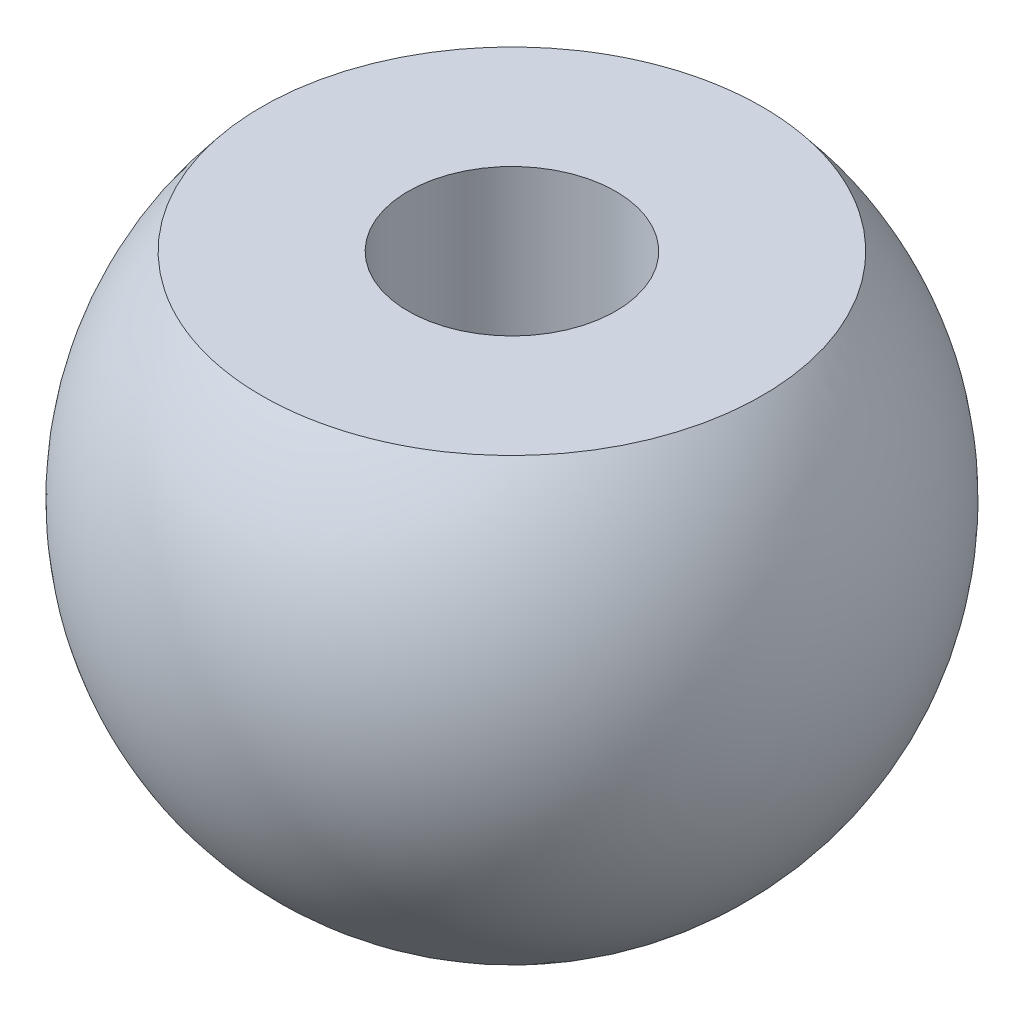
ISO-10303-21;
HEADER;
FILE_DESCRIPTION(('STEP AP214'),'2;1');
FILE_NAME('part.step','',(''),(''),'','','');
FILE_SCHEMA(('AUTOMOTIVE_DESIGN { 1 0 10303 214 1 1 1 1 }'));
ENDSEC;
DATA;
#1=APPLICATION_CONTEXT('core data for automotive mechanical design processes');
#2=APPLICATION_PROTOCOL_DEFINITION('international standard','automotive_design',2000,#1);
#3=PRODUCT_CONTEXT('',#1,'mechanical');
#4=PRODUCT('Part','Part','',(#3));
#5=PRODUCT_RELATED_PRODUCT_CATEGORY('part','',(#4));
#6=PRODUCT_DEFINITION_FORMATION('','',#4);
#7=PRODUCT_DEFINITION_CONTEXT('part definition',#1,'design');
#8=PRODUCT_DEFINITION('design','',#6,#7);
#9=PRODUCT_DEFINITION_SHAPE('','',#8);
#10=(LENGTH_UNIT() NAMED_UNIT(*) SI_UNIT(.MILLI.,.METRE.));
#11=(NAMED_UNIT(*) PLANE_ANGLE_UNIT() SI_UNIT($,.RADIAN.));
#12=(NAMED_UNIT(*) SI_UNIT($,.STERADIAN.) SOLID_ANGLE_UNIT());
#13=UNCERTAINTY_MEASURE_WITH_UNIT(LENGTH_MEASURE(1.E-05),#10,'distance_accuracy_value','');
#14=(GEOMETRIC_REPRESENTATION_CONTEXT(3) GLOBAL_UNCERTAINTY_ASSIGNED_CONTEXT((#13)) GLOBAL_UNIT_ASSIGNED_CONTEXT((#10,
#11,#12)) REPRESENTATION_CONTEXT('',''));
#15=CARTESIAN_POINT('',(0.,0.,0.));
#16=DIRECTION('',(0.,0.,1.));
#17=DIRECTION('',(1.,0.,0.));
#18=AXIS2_PLACEMENT_3D('',#15,#16,#17);
#19=CARTESIAN_POINT('',(0.,-10.,0.));
#20=DIRECTION('',(0.,1.,0.));
#21=DIRECTION('',(0.,0.,1.));
#22=AXIS2_PLACEMENT_3D('',#19,#20,#21);
#23=CYLINDRICAL_SURFACE('',#22,3.15);
#24=CARTESIAN_POINT('',(0.,6.50908328979756,0.));
#25=DIRECTION('',(0.,-1.,0.));
#26=DIRECTION('',(0.,0.,-1.));
#27=AXIS2_PLACEMENT_3D('',#24,#25,#26);
#28=CIRCLE('',#27,3.15);
#29=CARTESIAN_POINT('',(0.,6.50908328979756,-3.15));
#30=VERTEX_POINT('',#29);
#31=EDGE_CURVE('E124',#30,#30,#28,.T.);
#32=ORIENTED_EDGE('',*,*,#31,.F.);
#33=EDGE_LOOP('',(#32));
#34=FACE_BOUND('',#33,.T.);
#35=CARTESIAN_POINT('',(0.,-4.49091671020244,0.));
#36=DIRECTION('',(0.,-1.,0.));
#37=DIRECTION('',(0.,0.,-1.));
#38=AXIS2_PLACEMENT_3D('',#35,#36,#37);
#39=CIRCLE('',#38,3.15);
#40=CARTESIAN_POINT('',(0.,-4.49091671020244,-3.15));
#41=VERTEX_POINT('',#40);
#42=EDGE_CURVE('E141',#41,#41,#39,.F.);
#43=ORIENTED_EDGE('',*,*,#42,.F.);
#44=EDGE_LOOP('',(#43));
#45=FACE_BOUND('',#44,.T.);
#46=ADVANCED_FACE('F43',(#34,#45),#23,.F.);
#47=CARTESIAN_POINT('',(0.,0.,0.));
#48=DIRECTION('',(0.,0.,-1.));
#49=DIRECTION('',(1.,0.,0.));
#50=AXIS2_PLACEMENT_3D('',#47,#48,#49);
#51=SPHERICAL_SURFACE('',#50,10.);
#52=CARTESIAN_POINT('',(0.,6.50908328979756,0.));
#53=DIRECTION('',(0.,-1.,0.));
#54=DIRECTION('',(0.,0.,-1.));
#55=AXIS2_PLACEMENT_3D('',#52,#53,#54);
#56=CIRCLE('',#55,7.5915633914549);
#57=CARTESIAN_POINT('',(0.,6.50908328979756,-7.5915633914549));
#58=VERTEX_POINT('',#57);
#59=EDGE_CURVE('E47',#58,#58,#56,.T.);
#60=ORIENTED_EDGE('',*,*,#59,.T.);
#61=EDGE_LOOP('',(#60));
#62=FACE_BOUND('',#61,.T.);
#63=CARTESIAN_POINT('',(-2.77497783543476,0.,4.30872637943578));
#64=DIRECTION('',(-0.541459089840929,0.,0.840727098426494));
#65=DIRECTION('',(0.840727098426494,0.,0.541459089840929));
#66=AXIS2_PLACEMENT_3D('',#63,#64,#65);
#67=CIRCLE('',#66,8.58687224779779);
#68=CARTESIAN_POINT('',(-5.26262217046646,-8.06096561626872,2.70659217915228));
#69=VERTEX_POINT('',#68);
#70=CARTESIAN_POINT('',(-0.287333500403072,-8.06096561626872,5.91086057971929));
#71=VERTEX_POINT('',#70);
#72=EDGE_CURVE('E158',#69,#71,#67,.T.);
#73=ORIENTED_EDGE('',*,*,#72,.T.);
#74=CARTESIAN_POINT('',(2.34397758483015,0.,4.55756449014315));
#75=DIRECTION('',(0.457361479966859,0.,0.889280876125493));
#76=DIRECTION('',(0.889280876125493,0.,-0.457361479966859));
#77=AXIS2_PLACEMENT_3D('',#74,#75,#76);
#78=CIRCLE('',#77,8.58687224779779);
#79=CARTESIAN_POINT('',(4.97528867006338,-8.06096561626872,3.20426840056701));
#80=VERTEX_POINT('',#79);
#81=EDGE_CURVE('E11',#71,#80,#78,.T.);
#82=ORIENTED_EDGE('',*,*,#81,.T.);
#83=CARTESIAN_POINT('',(5.11895542026492,0.,0.248838110707367));
#84=DIRECTION('',(0.998820569807789,0.,0.0485537776989985));
#85=DIRECTION('',(0.0485537776989985,0.,-0.998820569807789));
#86=AXIS2_PLACEMENT_3D('',#83,#84,#85);
#87=CIRCLE('',#86,8.58687224779779);
#88=CARTESIAN_POINT('',(5.26262217046645,-8.06096561626872,-2.70659217915228));
#89=VERTEX_POINT('',#88);
#90=EDGE_CURVE('E53',#80,#89,#87,.T.);
#91=ORIENTED_EDGE('',*,*,#90,.T.);
#92=CARTESIAN_POINT('',(2.77497783543476,0.,-4.30872637943578));
#93=DIRECTION('',(0.54145908984093,0.,-0.840727098426494));
#94=DIRECTION('',(-0.840727098426494,0.,-0.54145908984093));
#95=AXIS2_PLACEMENT_3D('',#92,#93,#94);
#96=CIRCLE('',#95,8.58687224779779);
#97=CARTESIAN_POINT('',(0.287333500403075,-8.06096561626873,-5.91086057971929));
#98=VERTEX_POINT('',#97);
#99=EDGE_CURVE('E169',#89,#98,#96,.T.);
#100=ORIENTED_EDGE('',*,*,#99,.T.);
#101=CARTESIAN_POINT('',(-2.34397758483015,0.,-4.55756449014315));
#102=DIRECTION('',(-0.457361479966859,0.,-0.889280876125493));
#103=DIRECTION('',(-0.889280876125493,0.,0.457361479966859));
#104=AXIS2_PLACEMENT_3D('',#101,#102,#103);
#105=CIRCLE('',#104,8.5868722477978);
#106=CARTESIAN_POINT('',(-4.97528867006338,-8.06096561626873,-3.20426840056701));
#107=VERTEX_POINT('',#106);
#108=EDGE_CURVE('E165',#98,#107,#105,.T.);
#109=ORIENTED_EDGE('',*,*,#108,.T.);
#110=CARTESIAN_POINT('',(-5.11895542026492,0.,-0.248838110707369));
#111=DIRECTION('',(-0.998820569807789,0.,-0.0485537776989988));
#112=DIRECTION('',(-0.0485537776989988,0.,0.998820569807789));
#113=AXIS2_PLACEMENT_3D('',#110,#111,#112);
#114=CIRCLE('',#113,8.5868722477978);
#115=EDGE_CURVE('E161',#107,#69,#114,.T.);
#116=ORIENTED_EDGE('',*,*,#115,.T.);
#117=EDGE_LOOP('',(#73,#82,#91,#100,#109,#116));
#118=FACE_BOUND('',#117,.T.);
#119=ADVANCED_FACE('F45',(#62,#118),#51,.T.);
#120=CARTESIAN_POINT('',(4.97528867006338,-4.49091671020244,3.20426840056701));
#121=DIRECTION('',(0.457361479966859,0.,0.889280876125493));
#122=DIRECTION('',(0.889280876125493,0.,-0.457361479966859));
#123=AXIS2_PLACEMENT_3D('',#120,#121,#122);
#124=PLANE('',#123);
#125=DIRECTION('',(0.,-1.,0.));
#126=VECTOR('',#125,1.);
#127=CARTESIAN_POINT('',(-0.287333500403072,-4.49091671020244,5.91086057971929));
#128=LINE('',#127,#126);
#129=CARTESIAN_POINT('',(-0.287333500403072,-4.49091671020244,5.91086057971929));
#130=VERTEX_POINT('',#129);
#131=EDGE_CURVE('E60',#130,#71,#128,.T.);
#132=ORIENTED_EDGE('',*,*,#131,.F.);
#133=DIRECTION('',(-0.889280876125493,0.,0.457361479966859));
#134=VECTOR('',#133,1.);
#135=CARTESIAN_POINT('',(4.97528867006338,-4.49091671020244,3.20426840056701));
#136=LINE('',#135,#134);
#137=CARTESIAN_POINT('',(4.97528867006338,-4.49091671020244,3.20426840056701));
#138=VERTEX_POINT('',#137);
#139=EDGE_CURVE('E99',#138,#130,#136,.T.);
#140=ORIENTED_EDGE('',*,*,#139,.F.);
#141=DIRECTION('',(0.,-1.,0.));
#142=VECTOR('',#141,1.);
#143=CARTESIAN_POINT('',(4.97528867006338,-4.49091671020244,3.20426840056701));
#144=LINE('',#143,#142);
#145=EDGE_CURVE('E138',#138,#80,#144,.T.);
#146=ORIENTED_EDGE('',*,*,#145,.T.);
#147=ORIENTED_EDGE('',*,*,#81,.F.);
#148=EDGE_LOOP('',(#132,#140,#146,#147));
#149=FACE_BOUND('',#148,.T.);
#150=ADVANCED_FACE('F97',(#149),#124,.F.);
#151=CARTESIAN_POINT('',(5.26262217046645,-4.49091671020244,-2.70659217915228));
#152=DIRECTION('',(0.998820569807789,0.,0.0485537776989985));
#153=DIRECTION('',(0.0485537776989985,0.,-0.998820569807789));
#154=AXIS2_PLACEMENT_3D('',#151,#152,#153);
#155=PLANE('',#154);
#156=ORIENTED_EDGE('',*,*,#145,.F.);
#157=DIRECTION('',(-0.0485537776989985,0.,0.998820569807789));
#158=VECTOR('',#157,1.);
#159=CARTESIAN_POINT('',(5.26262217046645,-4.49091671020244,-2.70659217915228));
#160=LINE('',#159,#158);
#161=CARTESIAN_POINT('',(5.26262217046645,-4.49091671020244,-2.70659217915228));
#162=VERTEX_POINT('',#161);
#163=EDGE_CURVE('E104',#162,#138,#160,.T.);
#164=ORIENTED_EDGE('',*,*,#163,.F.);
#165=DIRECTION('',(0.,-1.,0.));
#166=VECTOR('',#165,1.);
#167=CARTESIAN_POINT('',(5.26262217046645,-4.49091671020244,-2.70659217915228));
#168=LINE('',#167,#166);
#169=EDGE_CURVE('E142',#162,#89,#168,.T.);
#170=ORIENTED_EDGE('',*,*,#169,.T.);
#171=ORIENTED_EDGE('',*,*,#90,.F.);
#172=EDGE_LOOP('',(#156,#164,#170,#171));
#173=FACE_BOUND('',#172,.T.);
#174=ADVANCED_FACE('F183',(#173),#155,.F.);
#175=CARTESIAN_POINT('',(0.287333500403075,-4.49091671020244,-5.91086057971929));
#176=DIRECTION('',(0.54145908984093,0.,-0.840727098426494));
#177=DIRECTION('',(-0.840727098426494,0.,-0.54145908984093));
#178=AXIS2_PLACEMENT_3D('',#175,#176,#177);
#179=PLANE('',#178);
#180=ORIENTED_EDGE('',*,*,#169,.F.);
#181=DIRECTION('',(0.840727098426494,0.,0.54145908984093));
#182=VECTOR('',#181,1.);
#183=CARTESIAN_POINT('',(0.287333500403075,-4.49091671020244,-5.91086057971929));
#184=LINE('',#183,#182);
#185=CARTESIAN_POINT('',(0.287333500403075,-4.49091671020244,-5.91086057971929));
#186=VERTEX_POINT('',#185);
#187=EDGE_CURVE('E133',#186,#162,#184,.T.);
#188=ORIENTED_EDGE('',*,*,#187,.F.);
#189=DIRECTION('',(0.,-1.,0.));
#190=VECTOR('',#189,1.);
#191=CARTESIAN_POINT('',(0.287333500403075,-4.49091671020244,-5.91086057971929));
#192=LINE('',#191,#190);
#193=EDGE_CURVE('E145',#186,#98,#192,.T.);
#194=ORIENTED_EDGE('',*,*,#193,.T.);
#195=ORIENTED_EDGE('',*,*,#99,.F.);
#196=EDGE_LOOP('',(#180,#188,#194,#195));
#197=FACE_BOUND('',#196,.T.);
#198=ADVANCED_FACE('F182',(#197),#179,.F.);
#199=CARTESIAN_POINT('',(-4.97528867006338,-4.49091671020244,-3.20426840056701));
#200=DIRECTION('',(-0.457361479966859,0.,-0.889280876125493));
#201=DIRECTION('',(-0.889280876125493,0.,0.457361479966859));
#202=AXIS2_PLACEMENT_3D('',#199,#200,#201);
#203=PLANE('',#202);
#204=ORIENTED_EDGE('',*,*,#193,.F.);
#205=DIRECTION('',(0.889280876125493,0.,-0.457361479966859));
#206=VECTOR('',#205,1.);
#207=CARTESIAN_POINT('',(-4.97528867006338,-4.49091671020244,-3.20426840056701));
#208=LINE('',#207,#206);
#209=CARTESIAN_POINT('',(-4.97528867006338,-4.49091671020244,-3.20426840056701));
#210=VERTEX_POINT('',#209);
#211=EDGE_CURVE('E129',#210,#186,#208,.T.);
#212=ORIENTED_EDGE('',*,*,#211,.F.);
#213=DIRECTION('',(0.,-1.,0.));
#214=VECTOR('',#213,1.);
#215=CARTESIAN_POINT('',(-4.97528867006338,-4.49091671020244,-3.20426840056701));
#216=LINE('',#215,#214);
#217=EDGE_CURVE('E149',#210,#107,#216,.T.);
#218=ORIENTED_EDGE('',*,*,#217,.T.);
#219=ORIENTED_EDGE('',*,*,#108,.F.);
#220=EDGE_LOOP('',(#204,#212,#218,#219));
#221=FACE_BOUND('',#220,.T.);
#222=ADVANCED_FACE('F180',(#221),#203,.F.);
#223=CARTESIAN_POINT('',(-5.26262217046645,-4.49091671020244,2.70659217915228));
#224=DIRECTION('',(-0.998820569807789,0.,-0.0485537776989988));
#225=DIRECTION('',(-0.0485537776989988,0.,0.998820569807789));
#226=AXIS2_PLACEMENT_3D('',#223,#224,#225);
#227=PLANE('',#226);
#228=ORIENTED_EDGE('',*,*,#217,.F.);
#229=DIRECTION('',(0.0485537776989988,0.,-0.998820569807789));
#230=VECTOR('',#229,1.);
#231=CARTESIAN_POINT('',(-5.26262217046645,-4.49091671020244,2.70659217915228));
#232=LINE('',#231,#230);
#233=CARTESIAN_POINT('',(-5.26262217046645,-4.49091671020244,2.70659217915228));
#234=VERTEX_POINT('',#233);
#235=EDGE_CURVE('E114',#234,#210,#232,.T.);
#236=ORIENTED_EDGE('',*,*,#235,.F.);
#237=DIRECTION('',(0.,-1.,0.));
#238=VECTOR('',#237,1.);
#239=CARTESIAN_POINT('',(-5.26262217046645,-4.49091671020244,2.70659217915228));
#240=LINE('',#239,#238);
#241=EDGE_CURVE('E103',#234,#69,#240,.T.);
#242=ORIENTED_EDGE('',*,*,#241,.T.);
#243=ORIENTED_EDGE('',*,*,#115,.F.);
#244=EDGE_LOOP('',(#228,#236,#242,#243));
#245=FACE_BOUND('',#244,.T.);
#246=ADVANCED_FACE('F176',(#245),#227,.F.);
#247=CARTESIAN_POINT('',(-0.287333500403072,-4.49091671020244,5.91086057971929));
#248=DIRECTION('',(-0.541459089840929,0.,0.840727098426494));
#249=DIRECTION('',(0.840727098426494,0.,0.541459089840929));
#250=AXIS2_PLACEMENT_3D('',#247,#248,#249);
#251=PLANE('',#250);
#252=ORIENTED_EDGE('',*,*,#241,.F.);
#253=DIRECTION('',(-0.840727098426494,0.,-0.541459089840929));
#254=VECTOR('',#253,1.);
#255=CARTESIAN_POINT('',(-0.287333500403072,-4.49091671020244,5.91086057971929));
#256=LINE('',#255,#254);
#257=EDGE_CURVE('E107',#130,#234,#256,.T.);
#258=ORIENTED_EDGE('',*,*,#257,.F.);
#259=ORIENTED_EDGE('',*,*,#131,.T.);
#260=ORIENTED_EDGE('',*,*,#72,.F.);
#261=EDGE_LOOP('',(#252,#258,#259,#260));
#262=FACE_BOUND('',#261,.T.);
#263=ADVANCED_FACE('F108',(#262),#251,.F.);
#264=CARTESIAN_POINT('',(0.,-4.49091671020244,0.));
#265=DIRECTION('',(0.,-1.,0.));
#266=DIRECTION('',(0.,0.,-1.));
#267=AXIS2_PLACEMENT_3D('',#264,#265,#266);
#268=PLANE('',#267);
#269=ORIENTED_EDGE('',*,*,#139,.T.);
#270=ORIENTED_EDGE('',*,*,#257,.T.);
#271=ORIENTED_EDGE('',*,*,#235,.T.);
#272=ORIENTED_EDGE('',*,*,#211,.T.);
#273=ORIENTED_EDGE('',*,*,#187,.T.);
#274=ORIENTED_EDGE('',*,*,#163,.T.);
#275=EDGE_LOOP('',(#269,#270,#271,#272,#273,#274));
#276=FACE_BOUND('',#275,.T.);
#277=ORIENTED_EDGE('',*,*,#42,.T.);
#278=EDGE_LOOP('',(#277));
#279=FACE_BOUND('',#278,.T.);
#280=ADVANCED_FACE('F116',(#276,#279),#268,.T.);
#281=CARTESIAN_POINT('',(0.,6.50908328979756,0.));
#282=DIRECTION('',(0.,-1.,0.));
#283=DIRECTION('',(0.,0.,-1.));
#284=AXIS2_PLACEMENT_3D('',#281,#282,#283);
#285=PLANE('',#284);
#286=ORIENTED_EDGE('',*,*,#31,.T.);
#287=EDGE_LOOP('',(#286));
#288=FACE_BOUND('',#287,.T.);
#289=ORIENTED_EDGE('',*,*,#59,.F.);
#290=EDGE_LOOP('',(#289));
#291=FACE_BOUND('',#290,.T.);
#292=ADVANCED_FACE('F225',(#288,#291),#285,.F.);
#293=CLOSED_SHELL('',(#46,#119,#150,#174,#198,#222,#246,#263,#280,#292));
#294=MANIFOLD_SOLID_BREP('B2',#293);
#295=ADVANCED_BREP_SHAPE_REPRESENTATION('',(#18,#294),#14);
#296=SHAPE_DEFINITION_REPRESENTATION(#9,#295);
ENDSEC;
END-ISO-10303-21;
